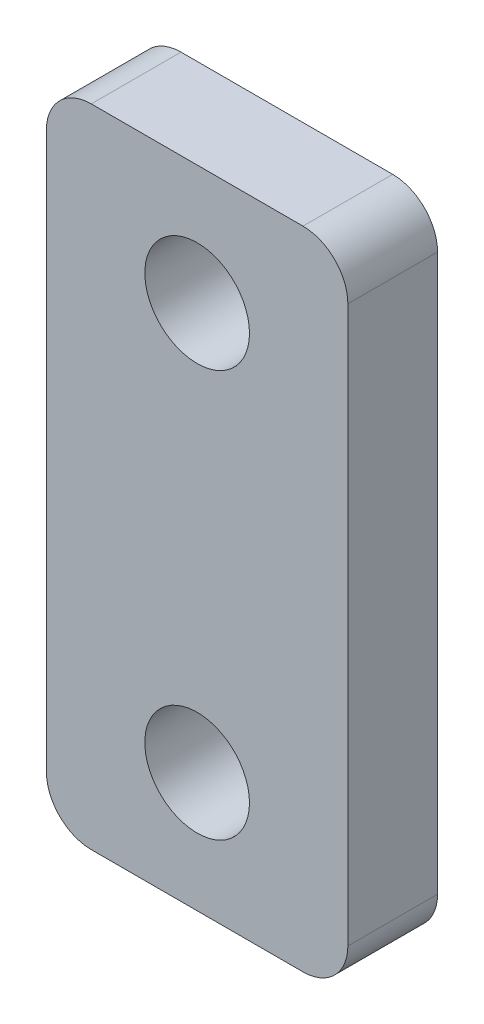
ISO-10303-21;
HEADER;
FILE_DESCRIPTION(('STEP AP214'),'2;1');
FILE_NAME('part.step','',(''),(''),'','','');
FILE_SCHEMA(('AUTOMOTIVE_DESIGN { 1 0 10303 214 1 1 1 1 }'));
ENDSEC;
DATA;
#1=APPLICATION_CONTEXT('core data for automotive mechanical design processes');
#2=APPLICATION_PROTOCOL_DEFINITION('international standard','automotive_design',2000,#1);
#3=PRODUCT_CONTEXT('',#1,'mechanical');
#4=PRODUCT('Part','Part','',(#3));
#5=PRODUCT_RELATED_PRODUCT_CATEGORY('part','',(#4));
#6=PRODUCT_DEFINITION_FORMATION('','',#4);
#7=PRODUCT_DEFINITION_CONTEXT('part definition',#1,'design');
#8=PRODUCT_DEFINITION('design','',#6,#7);
#9=PRODUCT_DEFINITION_SHAPE('','',#8);
#10=(LENGTH_UNIT() NAMED_UNIT(*) SI_UNIT(.MILLI.,.METRE.));
#11=(NAMED_UNIT(*) PLANE_ANGLE_UNIT() SI_UNIT($,.RADIAN.));
#12=(NAMED_UNIT(*) SI_UNIT($,.STERADIAN.) SOLID_ANGLE_UNIT());
#13=UNCERTAINTY_MEASURE_WITH_UNIT(LENGTH_MEASURE(1.E-05),#10,'distance_accuracy_value','');
#14=(GEOMETRIC_REPRESENTATION_CONTEXT(3) GLOBAL_UNCERTAINTY_ASSIGNED_CONTEXT((#13)) GLOBAL_UNIT_ASSIGNED_CONTEXT((#10,
#11,#12)) REPRESENTATION_CONTEXT('',''));
#15=CARTESIAN_POINT('',(0.,0.,0.));
#16=DIRECTION('',(0.,0.,1.));
#17=DIRECTION('',(1.,0.,0.));
#18=AXIS2_PLACEMENT_3D('',#15,#16,#17);
#19=CARTESIAN_POINT('',(7.07983072896417,-18.5996372763518,3.));
#20=DIRECTION('',(0.,0.,1.));
#21=DIRECTION('',(1.,0.,0.));
#22=AXIS2_PLACEMENT_3D('',#19,#20,#21);
#23=PLANE('',#22);
#24=CARTESIAN_POINT('',(0.,13.5996372763518,3.));
#25=DIRECTION('',(0.,0.,1.));
#26=DIRECTION('',(1.,0.,0.));
#27=AXIS2_PLACEMENT_3D('',#24,#25,#26);
#28=CIRCLE('',#27,3.5);
#29=CARTESIAN_POINT('',(3.5,13.5996372763518,3.));
#30=VERTEX_POINT('',#29);
#31=EDGE_CURVE('E139',#30,#30,#28,.T.);
#32=ORIENTED_EDGE('',*,*,#31,.F.);
#33=EDGE_LOOP('',(#32));
#34=FACE_BOUND('',#33,.T.);
#35=CARTESIAN_POINT('',(7.07983072896417,-18.5996372763518,3.));
#36=DIRECTION('',(0.,0.,1.));
#37=DIRECTION('',(1.,0.,0.));
#38=AXIS2_PLACEMENT_3D('',#35,#36,#37);
#39=CIRCLE('',#38,3.);
#40=CARTESIAN_POINT('',(7.07983072896415,-21.5996372763518,3.));
#41=VERTEX_POINT('',#40);
#42=CARTESIAN_POINT('',(10.0798307289642,-18.5996372763518,3.));
#43=VERTEX_POINT('',#42);
#44=EDGE_CURVE('E151',#41,#43,#39,.T.);
#45=ORIENTED_EDGE('',*,*,#44,.T.);
#46=DIRECTION('',(0.,1.,0.));
#47=VECTOR('',#46,1.);
#48=CARTESIAN_POINT('',(10.0798307289642,-18.5996372763518,3.));
#49=LINE('',#48,#47);
#50=CARTESIAN_POINT('',(10.0798307289642,18.5996372763518,3.));
#51=VERTEX_POINT('',#50);
#52=EDGE_CURVE('E97',#43,#51,#49,.T.);
#53=ORIENTED_EDGE('',*,*,#52,.T.);
#54=CARTESIAN_POINT('',(7.07983072896417,18.5996372763518,3.));
#55=DIRECTION('',(0.,0.,1.));
#56=DIRECTION('',(-1.,0.,0.));
#57=AXIS2_PLACEMENT_3D('',#54,#55,#56);
#58=CIRCLE('',#57,3.);
#59=CARTESIAN_POINT('',(7.07983072896415,21.5996372763518,3.));
#60=VERTEX_POINT('',#59);
#61=EDGE_CURVE('E167',#51,#60,#58,.T.);
#62=ORIENTED_EDGE('',*,*,#61,.T.);
#63=DIRECTION('',(-1.,0.,0.));
#64=VECTOR('',#63,1.);
#65=CARTESIAN_POINT('',(-7.07983072896415,21.5996372763518,3.));
#66=LINE('',#65,#64);
#67=CARTESIAN_POINT('',(-7.07983072896416,21.5996372763518,3.));
#68=VERTEX_POINT('',#67);
#69=EDGE_CURVE('E177',#60,#68,#66,.T.);
#70=ORIENTED_EDGE('',*,*,#69,.T.);
#71=CARTESIAN_POINT('',(-7.07983072896418,18.5996372763518,3.));
#72=DIRECTION('',(0.,0.,1.));
#73=DIRECTION('',(-1.,0.,0.));
#74=AXIS2_PLACEMENT_3D('',#71,#72,#73);
#75=CIRCLE('',#74,3.);
#76=CARTESIAN_POINT('',(-10.0798307289642,18.5996372763518,3.));
#77=VERTEX_POINT('',#76);
#78=EDGE_CURVE('E119',#68,#77,#75,.T.);
#79=ORIENTED_EDGE('',*,*,#78,.T.);
#80=DIRECTION('',(0.,-1.,0.));
#81=VECTOR('',#80,1.);
#82=CARTESIAN_POINT('',(-10.0798307289642,-18.5996372763518,3.));
#83=LINE('',#82,#81);
#84=CARTESIAN_POINT('',(-10.0798307289642,-18.5996372763518,3.));
#85=VERTEX_POINT('',#84);
#86=EDGE_CURVE('E115',#77,#85,#83,.T.);
#87=ORIENTED_EDGE('',*,*,#86,.T.);
#88=CARTESIAN_POINT('',(-7.07983072896418,-18.5996372763518,3.));
#89=DIRECTION('',(0.,0.,1.));
#90=DIRECTION('',(-1.,0.,0.));
#91=AXIS2_PLACEMENT_3D('',#88,#89,#90);
#92=CIRCLE('',#91,3.);
#93=CARTESIAN_POINT('',(-7.07983072896415,-21.5996372763518,3.));
#94=VERTEX_POINT('',#93);
#95=EDGE_CURVE('E117',#85,#94,#92,.T.);
#96=ORIENTED_EDGE('',*,*,#95,.T.);
#97=DIRECTION('',(1.,0.,0.));
#98=VECTOR('',#97,1.);
#99=CARTESIAN_POINT('',(-7.07983072896415,-21.5996372763518,3.));
#100=LINE('',#99,#98);
#101=EDGE_CURVE('E57',#94,#41,#100,.T.);
#102=ORIENTED_EDGE('',*,*,#101,.T.);
#103=EDGE_LOOP('',(#45,#53,#62,#70,#79,#87,#96,#102));
#104=FACE_BOUND('',#103,.T.);
#105=CARTESIAN_POINT('',(0.,-13.5996372763518,3.));
#106=DIRECTION('',(0.,0.,1.));
#107=DIRECTION('',(1.,0.,0.));
#108=AXIS2_PLACEMENT_3D('',#105,#106,#107);
#109=CIRCLE('',#108,3.5);
#110=CARTESIAN_POINT('',(3.5,-13.5996372763518,3.));
#111=VERTEX_POINT('',#110);
#112=EDGE_CURVE('E189',#111,#111,#109,.T.);
#113=ORIENTED_EDGE('',*,*,#112,.F.);
#114=EDGE_LOOP('',(#113));
#115=FACE_BOUND('',#114,.T.);
#116=ADVANCED_FACE('F39',(#34,#104,#115),#23,.T.);
#117=CARTESIAN_POINT('',(7.07983072896417,-18.5996372763518,-3.));
#118=DIRECTION('',(0.,0.,1.));
#119=DIRECTION('',(1.,0.,0.));
#120=AXIS2_PLACEMENT_3D('',#117,#118,#119);
#121=PLANE('',#120);
#122=CARTESIAN_POINT('',(7.07983072896417,-18.5996372763518,-3.));
#123=DIRECTION('',(0.,0.,1.));
#124=DIRECTION('',(1.,0.,0.));
#125=AXIS2_PLACEMENT_3D('',#122,#123,#124);
#126=CIRCLE('',#125,3.);
#127=CARTESIAN_POINT('',(7.07983072896415,-21.5996372763518,-3.));
#128=VERTEX_POINT('',#127);
#129=CARTESIAN_POINT('',(10.0798307289642,-18.5996372763518,-3.));
#130=VERTEX_POINT('',#129);
#131=EDGE_CURVE('E136',#128,#130,#126,.T.);
#132=ORIENTED_EDGE('',*,*,#131,.F.);
#133=DIRECTION('',(1.,0.,0.));
#134=VECTOR('',#133,1.);
#135=CARTESIAN_POINT('',(-7.07983072896415,-21.5996372763518,-3.));
#136=LINE('',#135,#134);
#137=CARTESIAN_POINT('',(-7.07983072896415,-21.5996372763518,-3.));
#138=VERTEX_POINT('',#137);
#139=EDGE_CURVE('E93',#138,#128,#136,.T.);
#140=ORIENTED_EDGE('',*,*,#139,.F.);
#141=CARTESIAN_POINT('',(-7.07983072896418,-18.5996372763518,-3.));
#142=DIRECTION('',(0.,0.,1.));
#143=DIRECTION('',(-1.,0.,0.));
#144=AXIS2_PLACEMENT_3D('',#141,#142,#143);
#145=CIRCLE('',#144,3.);
#146=CARTESIAN_POINT('',(-10.0798307289642,-18.5996372763518,-3.));
#147=VERTEX_POINT('',#146);
#148=EDGE_CURVE('E84',#147,#138,#145,.T.);
#149=ORIENTED_EDGE('',*,*,#148,.F.);
#150=DIRECTION('',(0.,-1.,0.));
#151=VECTOR('',#150,1.);
#152=CARTESIAN_POINT('',(-10.0798307289642,-18.5996372763518,-3.));
#153=LINE('',#152,#151);
#154=CARTESIAN_POINT('',(-10.0798307289642,18.5996372763518,-3.));
#155=VERTEX_POINT('',#154);
#156=EDGE_CURVE('E127',#155,#147,#153,.T.);
#157=ORIENTED_EDGE('',*,*,#156,.F.);
#158=CARTESIAN_POINT('',(-7.07983072896418,18.5996372763518,-3.));
#159=DIRECTION('',(0.,0.,1.));
#160=DIRECTION('',(-1.,0.,0.));
#161=AXIS2_PLACEMENT_3D('',#158,#159,#160);
#162=CIRCLE('',#161,3.);
#163=CARTESIAN_POINT('',(-7.07983072896416,21.5996372763518,-3.));
#164=VERTEX_POINT('',#163);
#165=EDGE_CURVE('E148',#164,#155,#162,.T.);
#166=ORIENTED_EDGE('',*,*,#165,.F.);
#167=DIRECTION('',(-1.,0.,0.));
#168=VECTOR('',#167,1.);
#169=CARTESIAN_POINT('',(-7.07983072896415,21.5996372763518,-3.));
#170=LINE('',#169,#168);
#171=CARTESIAN_POINT('',(7.07983072896415,21.5996372763518,-3.));
#172=VERTEX_POINT('',#171);
#173=EDGE_CURVE('E145',#172,#164,#170,.T.);
#174=ORIENTED_EDGE('',*,*,#173,.F.);
#175=CARTESIAN_POINT('',(7.07983072896417,18.5996372763518,-3.));
#176=DIRECTION('',(0.,0.,1.));
#177=DIRECTION('',(-1.,0.,0.));
#178=AXIS2_PLACEMENT_3D('',#175,#176,#177);
#179=CIRCLE('',#178,3.);
#180=CARTESIAN_POINT('',(10.0798307289642,18.5996372763518,-3.));
#181=VERTEX_POINT('',#180);
#182=EDGE_CURVE('E142',#181,#172,#179,.T.);
#183=ORIENTED_EDGE('',*,*,#182,.F.);
#184=DIRECTION('',(0.,1.,0.));
#185=VECTOR('',#184,1.);
#186=CARTESIAN_POINT('',(10.0798307289642,-18.5996372763518,-3.));
#187=LINE('',#186,#185);
#188=EDGE_CURVE('E137',#130,#181,#187,.T.);
#189=ORIENTED_EDGE('',*,*,#188,.F.);
#190=EDGE_LOOP('',(#132,#140,#149,#157,#166,#174,#183,#189));
#191=FACE_BOUND('',#190,.T.);
#192=CARTESIAN_POINT('',(0.,13.5996372763518,-3.));
#193=DIRECTION('',(0.,0.,1.));
#194=DIRECTION('',(1.,0.,0.));
#195=AXIS2_PLACEMENT_3D('',#192,#193,#194);
#196=CIRCLE('',#195,3.5);
#197=CARTESIAN_POINT('',(3.5,13.5996372763518,-3.));
#198=VERTEX_POINT('',#197);
#199=EDGE_CURVE('E183',#198,#198,#196,.T.);
#200=ORIENTED_EDGE('',*,*,#199,.T.);
#201=EDGE_LOOP('',(#200));
#202=FACE_BOUND('',#201,.T.);
#203=CARTESIAN_POINT('',(0.,-13.5996372763518,-3.));
#204=DIRECTION('',(0.,0.,1.));
#205=DIRECTION('',(1.,0.,0.));
#206=AXIS2_PLACEMENT_3D('',#203,#204,#205);
#207=CIRCLE('',#206,3.5);
#208=CARTESIAN_POINT('',(3.5,-13.5996372763518,-3.));
#209=VERTEX_POINT('',#208);
#210=EDGE_CURVE('E191',#209,#209,#207,.T.);
#211=ORIENTED_EDGE('',*,*,#210,.T.);
#212=EDGE_LOOP('',(#211));
#213=FACE_BOUND('',#212,.T.);
#214=ADVANCED_FACE('F168',(#191,#202,#213),#121,.F.);
#215=CARTESIAN_POINT('',(7.07983072896417,-18.5996372763518,3.));
#216=DIRECTION('',(0.,0.,-1.));
#217=DIRECTION('',(-1.,0.,0.));
#218=AXIS2_PLACEMENT_3D('',#215,#216,#217);
#219=CYLINDRICAL_SURFACE('',#218,3.);
#220=ORIENTED_EDGE('',*,*,#131,.T.);
#221=DIRECTION('',(0.,0.,-1.));
#222=VECTOR('',#221,1.);
#223=CARTESIAN_POINT('',(10.0798307289642,-18.5996372763518,3.));
#224=LINE('',#223,#222);
#225=EDGE_CURVE('E11',#43,#130,#224,.T.);
#226=ORIENTED_EDGE('',*,*,#225,.F.);
#227=ORIENTED_EDGE('',*,*,#44,.F.);
#228=DIRECTION('',(0.,0.,-1.));
#229=VECTOR('',#228,1.);
#230=CARTESIAN_POINT('',(7.07983072896415,-21.5996372763518,3.));
#231=LINE('',#230,#229);
#232=EDGE_CURVE('E135',#41,#128,#231,.T.);
#233=ORIENTED_EDGE('',*,*,#232,.T.);
#234=EDGE_LOOP('',(#220,#226,#227,#233));
#235=FACE_BOUND('',#234,.T.);
#236=ADVANCED_FACE('F41',(#235),#219,.T.);
#237=CARTESIAN_POINT('',(10.0798307289642,-18.5996372763518,3.));
#238=DIRECTION('',(-1.,0.,0.));
#239=DIRECTION('',(0.,0.,1.));
#240=AXIS2_PLACEMENT_3D('',#237,#238,#239);
#241=PLANE('',#240);
#242=ORIENTED_EDGE('',*,*,#188,.T.);
#243=DIRECTION('',(0.,0.,-1.));
#244=VECTOR('',#243,1.);
#245=CARTESIAN_POINT('',(10.0798307289642,18.5996372763518,3.));
#246=LINE('',#245,#244);
#247=EDGE_CURVE('E48',#51,#181,#246,.T.);
#248=ORIENTED_EDGE('',*,*,#247,.F.);
#249=ORIENTED_EDGE('',*,*,#52,.F.);
#250=ORIENTED_EDGE('',*,*,#225,.T.);
#251=EDGE_LOOP('',(#242,#248,#249,#250));
#252=FACE_BOUND('',#251,.T.);
#253=ADVANCED_FACE('F224',(#252),#241,.F.);
#254=CARTESIAN_POINT('',(7.07983072896417,18.5996372763518,3.));
#255=DIRECTION('',(0.,0.,-1.));
#256=DIRECTION('',(-1.,0.,0.));
#257=AXIS2_PLACEMENT_3D('',#254,#255,#256);
#258=CYLINDRICAL_SURFACE('',#257,3.);
#259=ORIENTED_EDGE('',*,*,#182,.T.);
#260=DIRECTION('',(0.,0.,-1.));
#261=VECTOR('',#260,1.);
#262=CARTESIAN_POINT('',(7.07983072896415,21.5996372763518,3.));
#263=LINE('',#262,#261);
#264=EDGE_CURVE('E158',#60,#172,#263,.T.);
#265=ORIENTED_EDGE('',*,*,#264,.F.);
#266=ORIENTED_EDGE('',*,*,#61,.F.);
#267=ORIENTED_EDGE('',*,*,#247,.T.);
#268=EDGE_LOOP('',(#259,#265,#266,#267));
#269=FACE_BOUND('',#268,.T.);
#270=ADVANCED_FACE('F163',(#269),#258,.T.);
#271=CARTESIAN_POINT('',(-7.07983072896415,21.5996372763518,3.));
#272=DIRECTION('',(0.,-1.,0.));
#273=DIRECTION('',(0.,0.,-1.));
#274=AXIS2_PLACEMENT_3D('',#271,#272,#273);
#275=PLANE('',#274);
#276=ORIENTED_EDGE('',*,*,#173,.T.);
#277=DIRECTION('',(0.,0.,-1.));
#278=VECTOR('',#277,1.);
#279=CARTESIAN_POINT('',(-7.07983072896416,21.5996372763518,3.));
#280=LINE('',#279,#278);
#281=EDGE_CURVE('E154',#68,#164,#280,.T.);
#282=ORIENTED_EDGE('',*,*,#281,.F.);
#283=ORIENTED_EDGE('',*,*,#69,.F.);
#284=ORIENTED_EDGE('',*,*,#264,.T.);
#285=EDGE_LOOP('',(#276,#282,#283,#284));
#286=FACE_BOUND('',#285,.T.);
#287=ADVANCED_FACE('F173',(#286),#275,.F.);
#288=CARTESIAN_POINT('',(-7.07983072896418,18.5996372763518,3.));
#289=DIRECTION('',(0.,0.,-1.));
#290=DIRECTION('',(-1.,0.,0.));
#291=AXIS2_PLACEMENT_3D('',#288,#289,#290);
#292=CYLINDRICAL_SURFACE('',#291,3.);
#293=ORIENTED_EDGE('',*,*,#165,.T.);
#294=DIRECTION('',(0.,0.,-1.));
#295=VECTOR('',#294,1.);
#296=CARTESIAN_POINT('',(-10.0798307289642,18.5996372763518,3.));
#297=LINE('',#296,#295);
#298=EDGE_CURVE('E130',#77,#155,#297,.T.);
#299=ORIENTED_EDGE('',*,*,#298,.F.);
#300=ORIENTED_EDGE('',*,*,#78,.F.);
#301=ORIENTED_EDGE('',*,*,#281,.T.);
#302=EDGE_LOOP('',(#293,#299,#300,#301));
#303=FACE_BOUND('',#302,.T.);
#304=ADVANCED_FACE('F178',(#303),#292,.T.);
#305=CARTESIAN_POINT('',(-10.0798307289642,-18.5996372763518,3.));
#306=DIRECTION('',(1.,0.,0.));
#307=DIRECTION('',(0.,0.,-1.));
#308=AXIS2_PLACEMENT_3D('',#305,#306,#307);
#309=PLANE('',#308);
#310=ORIENTED_EDGE('',*,*,#156,.T.);
#311=DIRECTION('',(0.,0.,-1.));
#312=VECTOR('',#311,1.);
#313=CARTESIAN_POINT('',(-10.0798307289642,-18.5996372763518,3.));
#314=LINE('',#313,#312);
#315=EDGE_CURVE('E123',#85,#147,#314,.T.);
#316=ORIENTED_EDGE('',*,*,#315,.F.);
#317=ORIENTED_EDGE('',*,*,#86,.F.);
#318=ORIENTED_EDGE('',*,*,#298,.T.);
#319=EDGE_LOOP('',(#310,#316,#317,#318));
#320=FACE_BOUND('',#319,.T.);
#321=ADVANCED_FACE('F122',(#320),#309,.F.);
#322=CARTESIAN_POINT('',(-7.07983072896418,-18.5996372763518,3.));
#323=DIRECTION('',(0.,0.,-1.));
#324=DIRECTION('',(-1.,0.,0.));
#325=AXIS2_PLACEMENT_3D('',#322,#323,#324);
#326=CYLINDRICAL_SURFACE('',#325,3.);
#327=ORIENTED_EDGE('',*,*,#148,.T.);
#328=DIRECTION('',(0.,0.,-1.));
#329=VECTOR('',#328,1.);
#330=CARTESIAN_POINT('',(-7.07983072896415,-21.5996372763518,3.));
#331=LINE('',#330,#329);
#332=EDGE_CURVE('E126',#94,#138,#331,.T.);
#333=ORIENTED_EDGE('',*,*,#332,.F.);
#334=ORIENTED_EDGE('',*,*,#95,.F.);
#335=ORIENTED_EDGE('',*,*,#315,.T.);
#336=EDGE_LOOP('',(#327,#333,#334,#335));
#337=FACE_BOUND('',#336,.T.);
#338=ADVANCED_FACE('F128',(#337),#326,.T.);
#339=CARTESIAN_POINT('',(-7.07983072896415,-21.5996372763518,3.));
#340=DIRECTION('',(0.,1.,0.));
#341=DIRECTION('',(0.,0.,1.));
#342=AXIS2_PLACEMENT_3D('',#339,#340,#341);
#343=PLANE('',#342);
#344=ORIENTED_EDGE('',*,*,#139,.T.);
#345=ORIENTED_EDGE('',*,*,#232,.F.);
#346=ORIENTED_EDGE('',*,*,#101,.F.);
#347=ORIENTED_EDGE('',*,*,#332,.T.);
#348=EDGE_LOOP('',(#344,#345,#346,#347));
#349=FACE_BOUND('',#348,.T.);
#350=ADVANCED_FACE('F211',(#349),#343,.F.);
#351=CARTESIAN_POINT('',(0.,13.5996372763518,3.));
#352=DIRECTION('',(0.,0.,-1.));
#353=DIRECTION('',(-1.,0.,0.));
#354=AXIS2_PLACEMENT_3D('',#351,#352,#353);
#355=CYLINDRICAL_SURFACE('',#354,3.5);
#356=ORIENTED_EDGE('',*,*,#31,.T.);
#357=EDGE_LOOP('',(#356));
#358=FACE_BOUND('',#357,.T.);
#359=ORIENTED_EDGE('',*,*,#199,.F.);
#360=EDGE_LOOP('',(#359));
#361=FACE_BOUND('',#360,.T.);
#362=ADVANCED_FACE('F208',(#358,#361),#355,.F.);
#363=CARTESIAN_POINT('',(0.,-13.5996372763518,3.));
#364=DIRECTION('',(0.,0.,-1.));
#365=DIRECTION('',(-1.,0.,0.));
#366=AXIS2_PLACEMENT_3D('',#363,#364,#365);
#367=CYLINDRICAL_SURFACE('',#366,3.5);
#368=ORIENTED_EDGE('',*,*,#112,.T.);
#369=EDGE_LOOP('',(#368));
#370=FACE_BOUND('',#369,.T.);
#371=ORIENTED_EDGE('',*,*,#210,.F.);
#372=EDGE_LOOP('',(#371));
#373=FACE_BOUND('',#372,.T.);
#374=ADVANCED_FACE('F197',(#370,#373),#367,.F.);
#375=CLOSED_SHELL('',(#116,#214,#236,#253,#270,#287,#304,#321,#338,#350,#362,#374));
#376=MANIFOLD_SOLID_BREP('B2',#375);
#377=ADVANCED_BREP_SHAPE_REPRESENTATION('',(#18,#376),#14);
#378=SHAPE_DEFINITION_REPRESENTATION(#9,#377);
ENDSEC;
END-ISO-10303-21;
